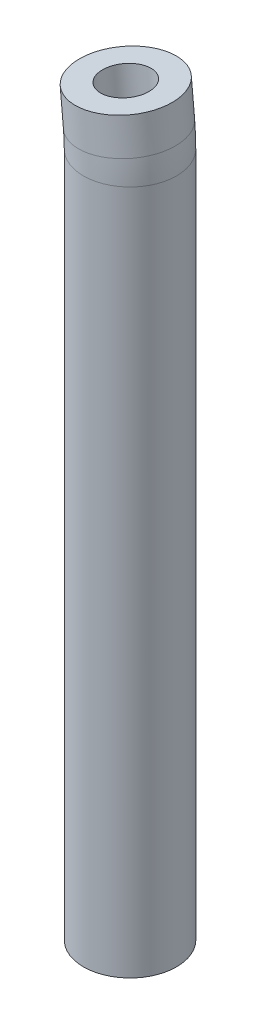
ISO-10303-21;
HEADER;
FILE_DESCRIPTION(('STEP AP214'),'2;1');
FILE_NAME('part.step','',(''),(''),'','','');
FILE_SCHEMA(('AUTOMOTIVE_DESIGN { 1 0 10303 214 1 1 1 1 }'));
ENDSEC;
DATA;
#1=APPLICATION_CONTEXT('core data for automotive mechanical design processes');
#2=APPLICATION_PROTOCOL_DEFINITION('international standard','automotive_design',2000,#1);
#3=PRODUCT_CONTEXT('',#1,'mechanical');
#4=PRODUCT('Part','Part','',(#3));
#5=PRODUCT_RELATED_PRODUCT_CATEGORY('part','',(#4));
#6=PRODUCT_DEFINITION_FORMATION('','',#4);
#7=PRODUCT_DEFINITION_CONTEXT('part definition',#1,'design');
#8=PRODUCT_DEFINITION('design','',#6,#7);
#9=PRODUCT_DEFINITION_SHAPE('','',#8);
#10=(LENGTH_UNIT() NAMED_UNIT(*) SI_UNIT(.MILLI.,.METRE.));
#11=(NAMED_UNIT(*) PLANE_ANGLE_UNIT() SI_UNIT($,.RADIAN.));
#12=(NAMED_UNIT(*) SI_UNIT($,.STERADIAN.) SOLID_ANGLE_UNIT());
#13=UNCERTAINTY_MEASURE_WITH_UNIT(LENGTH_MEASURE(1.E-05),#10,'distance_accuracy_value','');
#14=(GEOMETRIC_REPRESENTATION_CONTEXT(3) GLOBAL_UNCERTAINTY_ASSIGNED_CONTEXT((#13)) GLOBAL_UNIT_ASSIGNED_CONTEXT((#10,
#11,#12)) REPRESENTATION_CONTEXT('',''));
#15=CARTESIAN_POINT('',(0.,0.,0.));
#16=DIRECTION('',(0.,0.,1.));
#17=DIRECTION('',(1.,0.,0.));
#18=AXIS2_PLACEMENT_3D('',#15,#16,#17);
#19=CARTESIAN_POINT('',(0.,0.,0.));
#20=DIRECTION('',(0.,1.,0.));
#21=DIRECTION('',(0.,0.,1.));
#22=AXIS2_PLACEMENT_3D('',#19,#20,#21);
#23=CYLINDRICAL_SURFACE('',#22,2.);
#24=CARTESIAN_POINT('',(0.,29.4441537151081,0.));
#25=DIRECTION('',(0.,1.,0.));
#26=DIRECTION('',(0.,0.,1.));
#27=AXIS2_PLACEMENT_3D('',#24,#25,#26);
#28=CIRCLE('',#27,2.);
#29=CARTESIAN_POINT('',(2.,29.4441537151081,0.));
#30=VERTEX_POINT('',#29);
#31=EDGE_CURVE('E57',#30,#30,#28,.T.);
#32=ORIENTED_EDGE('',*,*,#31,.F.);
#33=EDGE_LOOP('',(#32));
#34=FACE_BOUND('',#33,.T.);
#35=CARTESIAN_POINT('',(0.,0.,0.));
#36=DIRECTION('',(0.,1.,0.));
#37=DIRECTION('',(0.,0.,1.));
#38=AXIS2_PLACEMENT_3D('',#35,#36,#37);
#39=CIRCLE('',#38,2.);
#40=CARTESIAN_POINT('',(0.,0.,2.));
#41=VERTEX_POINT('',#40);
#42=EDGE_CURVE('E55',#41,#41,#39,.T.);
#43=ORIENTED_EDGE('',*,*,#42,.T.);
#44=EDGE_LOOP('',(#43));
#45=FACE_BOUND('',#44,.T.);
#46=ADVANCED_FACE('F34',(#34,#45),#23,.T.);
#47=CARTESIAN_POINT('',(-10.,29.4441537151082,0.));
#48=DIRECTION('',(0.,0.,1.));
#49=DIRECTION('',(1.,0.,0.));
#50=AXIS2_PLACEMENT_3D('',#47,#48,#49);
#51=TOROIDAL_SURFACE('',#50,10.,2.);
#52=CARTESIAN_POINT('',(-0.0414729879481476,30.3539557541439,0.));
#53=DIRECTION('',(-0.0909802039035748,0.995852701205185,0.));
#54=DIRECTION('',(0.,0.,1.));
#55=AXIS2_PLACEMENT_3D('',#52,#53,#54);
#56=CIRCLE('',#55,2.);
#57=CARTESIAN_POINT('',(1.95023241446222,30.5359161619511,0.));
#58=VERTEX_POINT('',#57);
#59=EDGE_CURVE('E38',#58,#58,#56,.T.);
#60=CARTESIAN_POINT('',(-10.,29.4441537151082,0.));
#61=DIRECTION('',(0.,0.,1.));
#62=DIRECTION('',(1.,0.,0.));
#63=AXIS2_PLACEMENT_3D('',#60,#61,#62);
#64=CIRCLE('',#63,12.);
#65=EDGE_CURVE('',#30,#58,#64,.T.);
#66=ORIENTED_EDGE('',*,*,#31,.T.);
#67=ORIENTED_EDGE('',*,*,#59,.F.);
#68=ORIENTED_EDGE('',*,*,#65,.T.);
#69=ORIENTED_EDGE('',*,*,#65,.F.);
#70=EDGE_LOOP('',(#66,#68,#67,#69));
#71=FACE_BOUND('',#70,.T.);
#72=ADVANCED_FACE('F65',(#71),#51,.T.);
#73=CARTESIAN_POINT('',(-0.0414729879481467,30.3539557541439,0.));
#74=DIRECTION('',(-0.0909802039035707,0.995852701205186,0.));
#75=DIRECTION('',(-0.995852701205186,-0.0909802039035707,0.));
#76=AXIS2_PLACEMENT_3D('',#73,#74,#75);
#77=CYLINDRICAL_SURFACE('',#76,2.);
#78=CARTESIAN_POINT('',(-0.182718194756044,31.9,0.));
#79=DIRECTION('',(-0.0909802039035708,0.995852701205186,0.));
#80=DIRECTION('',(0.,0.,1.));
#81=AXIS2_PLACEMENT_3D('',#78,#79,#80);
#82=CIRCLE('',#81,2.);
#83=CARTESIAN_POINT('',(-0.182718194756044,31.9,2.));
#84=VERTEX_POINT('',#83);
#85=EDGE_CURVE('E51',#84,#84,#82,.T.);
#86=ORIENTED_EDGE('',*,*,#85,.F.);
#87=EDGE_LOOP('',(#86));
#88=FACE_BOUND('',#87,.T.);
#89=ORIENTED_EDGE('',*,*,#59,.T.);
#90=EDGE_LOOP('',(#89));
#91=FACE_BOUND('',#90,.T.);
#92=ADVANCED_FACE('F36',(#88,#91),#77,.T.);
#93=CARTESIAN_POINT('',(0.,0.,0.));
#94=DIRECTION('',(0.,1.,0.));
#95=DIRECTION('',(0.,0.,1.));
#96=AXIS2_PLACEMENT_3D('',#93,#94,#95);
#97=PLANE('',#96);
#98=CARTESIAN_POINT('',(0.,0.,0.));
#99=DIRECTION('',(0.,1.,0.));
#100=DIRECTION('',(0.,0.,1.));
#101=AXIS2_PLACEMENT_3D('',#98,#99,#100);
#102=CIRCLE('',#101,1.);
#103=CARTESIAN_POINT('',(0.,0.,1.));
#104=VERTEX_POINT('',#103);
#105=EDGE_CURVE('E54',#104,#104,#102,.F.);
#106=ORIENTED_EDGE('',*,*,#105,.F.);
#107=EDGE_LOOP('',(#106));
#108=FACE_BOUND('',#107,.T.);
#109=ORIENTED_EDGE('',*,*,#42,.F.);
#110=EDGE_LOOP('',(#109));
#111=FACE_BOUND('',#110,.T.);
#112=ADVANCED_FACE('F71',(#108,#111),#97,.F.);
#113=CARTESIAN_POINT('',(-0.182718194756044,31.9,0.));
#114=DIRECTION('',(-0.0909802039035708,0.995852701205186,0.));
#115=DIRECTION('',(0.,0.,1.));
#116=AXIS2_PLACEMENT_3D('',#113,#114,#115);
#117=PLANE('',#116);
#118=CARTESIAN_POINT('',(-0.182718194756044,31.9,0.));
#119=DIRECTION('',(-0.0909802039035708,0.995852701205186,0.));
#120=DIRECTION('',(0.,0.,1.));
#121=AXIS2_PLACEMENT_3D('',#118,#119,#120);
#122=CIRCLE('',#121,1.);
#123=CARTESIAN_POINT('',(-0.182718194756044,31.9,1.));
#124=VERTEX_POINT('',#123);
#125=EDGE_CURVE('E10',#124,#124,#122,.F.);
#126=ORIENTED_EDGE('',*,*,#125,.T.);
#127=EDGE_LOOP('',(#126));
#128=FACE_BOUND('',#127,.T.);
#129=ORIENTED_EDGE('',*,*,#85,.T.);
#130=EDGE_LOOP('',(#129));
#131=FACE_BOUND('',#130,.T.);
#132=ADVANCED_FACE('F89',(#128,#131),#117,.T.);
#133=CARTESIAN_POINT('',(0.,0.,0.));
#134=DIRECTION('',(0.,1.,0.));
#135=DIRECTION('',(0.,0.,1.));
#136=AXIS2_PLACEMENT_3D('',#133,#134,#135);
#137=CYLINDRICAL_SURFACE('',#136,1.);
#138=CARTESIAN_POINT('',(0.,29.4441537151081,0.));
#139=DIRECTION('',(0.,1.,0.));
#140=DIRECTION('',(0.,0.,1.));
#141=AXIS2_PLACEMENT_3D('',#138,#139,#140);
#142=CIRCLE('',#141,1.);
#143=CARTESIAN_POINT('',(0.999999999999999,29.4441537151081,0.));
#144=VERTEX_POINT('',#143);
#145=EDGE_CURVE('E47',#144,#144,#142,.F.);
#146=ORIENTED_EDGE('',*,*,#145,.F.);
#147=EDGE_LOOP('',(#146));
#148=FACE_BOUND('',#147,.T.);
#149=ORIENTED_EDGE('',*,*,#105,.T.);
#150=EDGE_LOOP('',(#149));
#151=FACE_BOUND('',#150,.T.);
#152=ADVANCED_FACE('F83',(#148,#151),#137,.F.);
#153=CARTESIAN_POINT('',(-10.,29.4441537151082,0.));
#154=DIRECTION('',(0.,0.,1.));
#155=DIRECTION('',(1.,0.,0.));
#156=AXIS2_PLACEMENT_3D('',#153,#154,#155);
#157=TOROIDAL_SURFACE('',#156,10.,1.);
#158=CARTESIAN_POINT('',(-0.0414729879481476,30.3539557541439,0.));
#159=DIRECTION('',(-0.0909802039035748,0.995852701205185,0.));
#160=DIRECTION('',(0.,0.,1.));
#161=AXIS2_PLACEMENT_3D('',#158,#159,#160);
#162=CIRCLE('',#161,1.);
#163=CARTESIAN_POINT('',(0.954379713257037,30.4449359580475,0.));
#164=VERTEX_POINT('',#163);
#165=EDGE_CURVE('E42',#164,#164,#162,.F.);
#166=CARTESIAN_POINT('',(-10.,29.4441537151082,0.));
#167=DIRECTION('',(0.,0.,1.));
#168=DIRECTION('',(1.,0.,0.));
#169=AXIS2_PLACEMENT_3D('',#166,#167,#168);
#170=CIRCLE('',#169,11.);
#171=EDGE_CURVE('',#144,#164,#170,.T.);
#172=ORIENTED_EDGE('',*,*,#145,.T.);
#173=ORIENTED_EDGE('',*,*,#165,.F.);
#174=ORIENTED_EDGE('',*,*,#171,.T.);
#175=ORIENTED_EDGE('',*,*,#171,.F.);
#176=EDGE_LOOP('',(#172,#174,#173,#175));
#177=FACE_BOUND('',#176,.T.);
#178=ADVANCED_FACE('F77',(#177),#157,.F.);
#179=CARTESIAN_POINT('',(-0.0414729879481467,30.3539557541439,0.));
#180=DIRECTION('',(-0.0909802039035707,0.995852701205186,0.));
#181=DIRECTION('',(-0.995852701205186,-0.0909802039035707,0.));
#182=AXIS2_PLACEMENT_3D('',#179,#180,#181);
#183=CYLINDRICAL_SURFACE('',#182,1.);
#184=ORIENTED_EDGE('',*,*,#125,.F.);
#185=EDGE_LOOP('',(#184));
#186=FACE_BOUND('',#185,.T.);
#187=ORIENTED_EDGE('',*,*,#165,.T.);
#188=EDGE_LOOP('',(#187));
#189=FACE_BOUND('',#188,.T.);
#190=ADVANCED_FACE('F75',(#186,#189),#183,.F.);
#191=CLOSED_SHELL('',(#46,#72,#92,#112,#132,#152,#178,#190));
#192=MANIFOLD_SOLID_BREP('B2',#191);
#193=ADVANCED_BREP_SHAPE_REPRESENTATION('',(#18,#192),#14);
#194=SHAPE_DEFINITION_REPRESENTATION(#9,#193);
ENDSEC;
END-ISO-10303-21;
